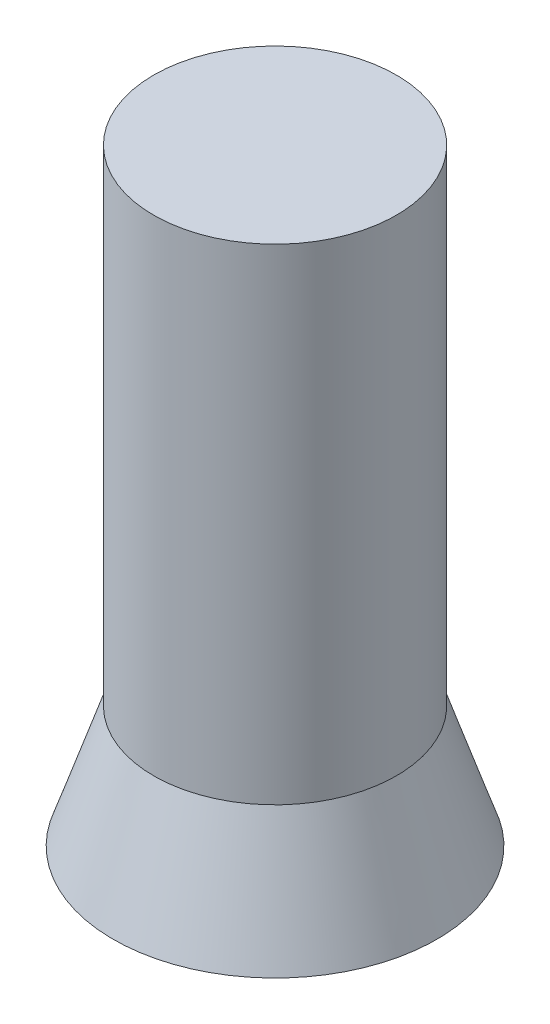
ISO-10303-21;
HEADER;
FILE_DESCRIPTION(('STEP AP214'),'2;1');
FILE_NAME('part.step','',(''),(''),'','','');
FILE_SCHEMA(('AUTOMOTIVE_DESIGN { 1 0 10303 214 1 1 1 1 }'));
ENDSEC;
DATA;
#1=APPLICATION_CONTEXT('core data for automotive mechanical design processes');
#2=APPLICATION_PROTOCOL_DEFINITION('international standard','automotive_design',2000,#1);
#3=PRODUCT_CONTEXT('',#1,'mechanical');
#4=PRODUCT('Part','Part','',(#3));
#5=PRODUCT_RELATED_PRODUCT_CATEGORY('part','',(#4));
#6=PRODUCT_DEFINITION_FORMATION('','',#4);
#7=PRODUCT_DEFINITION_CONTEXT('part definition',#1,'design');
#8=PRODUCT_DEFINITION('design','',#6,#7);
#9=PRODUCT_DEFINITION_SHAPE('','',#8);
#10=(LENGTH_UNIT() NAMED_UNIT(*) SI_UNIT(.MILLI.,.METRE.));
#11=(NAMED_UNIT(*) PLANE_ANGLE_UNIT() SI_UNIT($,.RADIAN.));
#12=(NAMED_UNIT(*) SI_UNIT($,.STERADIAN.) SOLID_ANGLE_UNIT());
#13=UNCERTAINTY_MEASURE_WITH_UNIT(LENGTH_MEASURE(1.E-05),#10,'distance_accuracy_value','');
#14=(GEOMETRIC_REPRESENTATION_CONTEXT(3) GLOBAL_UNCERTAINTY_ASSIGNED_CONTEXT((#13)) GLOBAL_UNIT_ASSIGNED_CONTEXT((#10,
#11,#12)) REPRESENTATION_CONTEXT('',''));
#15=CARTESIAN_POINT('',(0.,0.,0.));
#16=DIRECTION('',(0.,0.,1.));
#17=DIRECTION('',(1.,0.,0.));
#18=AXIS2_PLACEMENT_3D('',#15,#16,#17);
#19=CARTESIAN_POINT('',(0.,0.,0.));
#20=DIRECTION('',(0.,1.,0.));
#21=DIRECTION('',(-1.,0.,0.));
#22=AXIS2_PLACEMENT_3D('',#19,#20,#21);
#23=PLANE('',#22);
#24=CARTESIAN_POINT('',(0.,0.,0.));
#25=DIRECTION('',(0.,1.,0.));
#26=DIRECTION('',(-1.,0.,0.));
#27=AXIS2_PLACEMENT_3D('',#24,#25,#26);
#28=CIRCLE('',#27,3.175);
#29=CARTESIAN_POINT('',(-3.175,0.,0.));
#30=VERTEX_POINT('',#29);
#31=EDGE_CURVE('E10',#30,#30,#28,.T.);
#32=ORIENTED_EDGE('',*,*,#31,.F.);
#33=EDGE_LOOP('',(#32));
#34=FACE_BOUND('',#33,.T.);
#35=ADVANCED_FACE('F39',(#34),#23,.F.);
#36=CARTESIAN_POINT('',(0.,2.38125,0.));
#37=DIRECTION('',(0.,-1.,0.));
#38=DIRECTION('',(1.,0.,0.));
#39=AXIS2_PLACEMENT_3D('',#36,#37,#38);
#40=CONICAL_SURFACE('',#39,2.38125,0.321750554396641);
#41=ORIENTED_EDGE('',*,*,#31,.T.);
#42=EDGE_LOOP('',(#41));
#43=FACE_BOUND('',#42,.T.);
#44=CARTESIAN_POINT('',(0.,2.38125,0.));
#45=DIRECTION('',(0.,1.,0.));
#46=DIRECTION('',(-1.,0.,0.));
#47=AXIS2_PLACEMENT_3D('',#44,#45,#46);
#48=CIRCLE('',#47,2.38125);
#49=CARTESIAN_POINT('',(-2.38125,2.38125,0.));
#50=VERTEX_POINT('',#49);
#51=EDGE_CURVE('E46',#50,#50,#48,.T.);
#52=ORIENTED_EDGE('',*,*,#51,.F.);
#53=EDGE_LOOP('',(#52));
#54=FACE_BOUND('',#53,.T.);
#55=ADVANCED_FACE('F63',(#43,#54),#40,.T.);
#56=CARTESIAN_POINT('',(0.,0.,0.));
#57=DIRECTION('',(0.,1.,0.));
#58=DIRECTION('',(-1.,0.,0.));
#59=AXIS2_PLACEMENT_3D('',#56,#57,#58);
#60=CYLINDRICAL_SURFACE('',#59,2.38125);
#61=ORIENTED_EDGE('',*,*,#51,.T.);
#62=EDGE_LOOP('',(#61));
#63=FACE_BOUND('',#62,.T.);
#64=CARTESIAN_POINT('',(0.,11.90625,0.));
#65=DIRECTION('',(0.,1.,0.));
#66=DIRECTION('',(-1.,0.,0.));
#67=AXIS2_PLACEMENT_3D('',#64,#65,#66);
#68=CIRCLE('',#67,2.38125);
#69=CARTESIAN_POINT('',(-2.38125,11.90625,0.));
#70=VERTEX_POINT('',#69);
#71=EDGE_CURVE('E51',#70,#70,#68,.T.);
#72=ORIENTED_EDGE('',*,*,#71,.F.);
#73=EDGE_LOOP('',(#72));
#74=FACE_BOUND('',#73,.T.);
#75=ADVANCED_FACE('F61',(#63,#74),#60,.T.);
#76=CARTESIAN_POINT('',(0.,11.90625,0.));
#77=DIRECTION('',(0.,1.,0.));
#78=DIRECTION('',(-1.,0.,0.));
#79=AXIS2_PLACEMENT_3D('',#76,#77,#78);
#80=PLANE('',#79);
#81=ORIENTED_EDGE('',*,*,#71,.T.);
#82=EDGE_LOOP('',(#81));
#83=FACE_BOUND('',#82,.T.);
#84=ADVANCED_FACE('F59',(#83),#80,.T.);
#85=CLOSED_SHELL('',(#35,#55,#75,#84));
#86=MANIFOLD_SOLID_BREP('B2',#85);
#87=ADVANCED_BREP_SHAPE_REPRESENTATION('',(#18,#86),#14);
#88=SHAPE_DEFINITION_REPRESENTATION(#9,#87);
ENDSEC;
END-ISO-10303-21;
